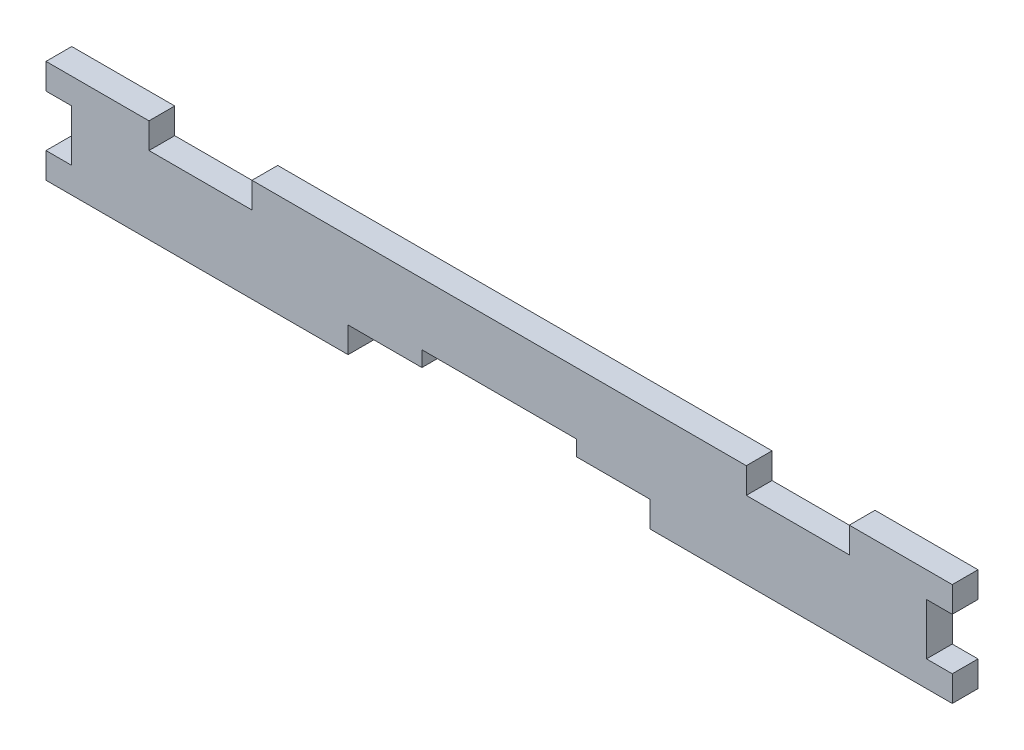
ISO-10303-21;
HEADER;
FILE_DESCRIPTION(('STEP AP214'),'2;1');
FILE_NAME('part.step','',(''),(''),'','','');
FILE_SCHEMA(('AUTOMOTIVE_DESIGN { 1 0 10303 214 1 1 1 1 }'));
ENDSEC;
DATA;
#1=APPLICATION_CONTEXT('core data for automotive mechanical design processes');
#2=APPLICATION_PROTOCOL_DEFINITION('international standard','automotive_design',2000,#1);
#3=PRODUCT_CONTEXT('',#1,'mechanical');
#4=PRODUCT('Part','Part','',(#3));
#5=PRODUCT_RELATED_PRODUCT_CATEGORY('part','',(#4));
#6=PRODUCT_DEFINITION_FORMATION('','',#4);
#7=PRODUCT_DEFINITION_CONTEXT('part definition',#1,'design');
#8=PRODUCT_DEFINITION('design','',#6,#7);
#9=PRODUCT_DEFINITION_SHAPE('','',#8);
#10=(LENGTH_UNIT() NAMED_UNIT(*) SI_UNIT(.MILLI.,.METRE.));
#11=(NAMED_UNIT(*) PLANE_ANGLE_UNIT() SI_UNIT($,.RADIAN.));
#12=(NAMED_UNIT(*) SI_UNIT($,.STERADIAN.) SOLID_ANGLE_UNIT());
#13=UNCERTAINTY_MEASURE_WITH_UNIT(LENGTH_MEASURE(1.E-05),#10,'distance_accuracy_value','');
#14=(GEOMETRIC_REPRESENTATION_CONTEXT(3) GLOBAL_UNCERTAINTY_ASSIGNED_CONTEXT((#13)) GLOBAL_UNIT_ASSIGNED_CONTEXT((#10,
#11,#12)) REPRESENTATION_CONTEXT('',''));
#15=CARTESIAN_POINT('',(0.,0.,0.));
#16=DIRECTION('',(0.,0.,1.));
#17=DIRECTION('',(1.,0.,0.));
#18=AXIS2_PLACEMENT_3D('',#15,#16,#17);
#19=CARTESIAN_POINT('',(58.6666666666667,5.,5.));
#20=DIRECTION('',(0.,1.,0.));
#21=DIRECTION('',(0.,0.,1.));
#22=AXIS2_PLACEMENT_3D('',#19,#20,#21);
#23=PLANE('',#22);
#24=DIRECTION('',(1.,0.,0.));
#25=VECTOR('',#24,1.);
#26=CARTESIAN_POINT('',(58.6666666666667,5.,0.));
#27=LINE('',#26,#25);
#28=CARTESIAN_POINT('',(58.6666666666667,5.,0.));
#29=VERTEX_POINT('',#28);
#30=CARTESIAN_POINT('',(73.0016666666667,5.,0.));
#31=VERTEX_POINT('',#30);
#32=EDGE_CURVE('E247',#29,#31,#27,.T.);
#33=ORIENTED_EDGE('',*,*,#32,.T.);
#34=DIRECTION('',(0.,0.,1.));
#35=VECTOR('',#34,1.);
#36=CARTESIAN_POINT('',(73.0016666666667,5.,-5.));
#37=LINE('',#36,#35);
#38=CARTESIAN_POINT('',(73.0016666666667,5.,5.));
#39=VERTEX_POINT('',#38);
#40=EDGE_CURVE('E378',#31,#39,#37,.T.);
#41=ORIENTED_EDGE('',*,*,#40,.T.);
#42=DIRECTION('',(1.,0.,0.));
#43=VECTOR('',#42,1.);
#44=CARTESIAN_POINT('',(58.6666666666667,5.,5.));
#45=LINE('',#44,#43);
#46=CARTESIAN_POINT('',(58.6666666666667,5.,5.));
#47=VERTEX_POINT('',#46);
#48=EDGE_CURVE('E390',#47,#39,#45,.T.);
#49=ORIENTED_EDGE('',*,*,#48,.F.);
#50=DIRECTION('',(0.,0.,-1.));
#51=VECTOR('',#50,1.);
#52=CARTESIAN_POINT('',(58.6666666666667,5.,5.));
#53=LINE('',#52,#51);
#54=EDGE_CURVE('E343',#47,#29,#53,.T.);
#55=ORIENTED_EDGE('',*,*,#54,.T.);
#56=EDGE_LOOP('',(#33,#41,#49,#55));
#57=FACE_BOUND('',#56,.T.);
#58=ADVANCED_FACE('F32',(#57),#23,.F.);
#59=CARTESIAN_POINT('',(0.,0.,5.));
#60=DIRECTION('',(1.,0.,0.));
#61=DIRECTION('',(0.,0.,-1.));
#62=AXIS2_PLACEMENT_3D('',#59,#60,#61);
#63=PLANE('',#62);
#64=DIRECTION('',(0.,-1.,0.));
#65=VECTOR('',#64,1.);
#66=CARTESIAN_POINT('',(0.,0.,0.));
#67=LINE('',#66,#65);
#68=CARTESIAN_POINT('',(0.,5.,0.));
#69=VERTEX_POINT('',#68);
#70=CARTESIAN_POINT('',(0.,0.,0.));
#71=VERTEX_POINT('',#70);
#72=EDGE_CURVE('E238',#69,#71,#67,.T.);
#73=ORIENTED_EDGE('',*,*,#72,.T.);
#74=DIRECTION('',(0.,0.,-1.));
#75=VECTOR('',#74,1.);
#76=CARTESIAN_POINT('',(0.,0.,5.));
#77=LINE('',#76,#75);
#78=CARTESIAN_POINT('',(0.,0.,5.));
#79=VERTEX_POINT('',#78);
#80=EDGE_CURVE('E349',#79,#71,#77,.T.);
#81=ORIENTED_EDGE('',*,*,#80,.F.);
#82=DIRECTION('',(0.,-1.,0.));
#83=VECTOR('',#82,1.);
#84=CARTESIAN_POINT('',(0.,0.,5.));
#85=LINE('',#84,#83);
#86=CARTESIAN_POINT('',(0.,5.,5.));
#87=VERTEX_POINT('',#86);
#88=EDGE_CURVE('E288',#87,#79,#85,.T.);
#89=ORIENTED_EDGE('',*,*,#88,.F.);
#90=DIRECTION('',(0.,0.,-1.));
#91=VECTOR('',#90,1.);
#92=CARTESIAN_POINT('',(0.,5.,5.));
#93=LINE('',#92,#91);
#94=EDGE_CURVE('E234',#87,#69,#93,.T.);
#95=ORIENTED_EDGE('',*,*,#94,.T.);
#96=EDGE_LOOP('',(#73,#81,#89,#95));
#97=FACE_BOUND('',#96,.T.);
#98=ADVANCED_FACE('F34',(#97),#63,.F.);
#99=CARTESIAN_POINT('',(0.,0.,5.));
#100=DIRECTION('',(0.,1.,0.));
#101=DIRECTION('',(0.,0.,1.));
#102=AXIS2_PLACEMENT_3D('',#99,#100,#101);
#103=PLANE('',#102);
#104=DIRECTION('',(1.,0.,0.));
#105=VECTOR('',#104,1.);
#106=CARTESIAN_POINT('',(0.,0.,0.));
#107=LINE('',#106,#105);
#108=CARTESIAN_POINT('',(58.6666666666667,0.,0.));
#109=VERTEX_POINT('',#108);
#110=EDGE_CURVE('E241',#71,#109,#107,.T.);
#111=ORIENTED_EDGE('',*,*,#110,.T.);
#112=DIRECTION('',(0.,0.,-1.));
#113=VECTOR('',#112,1.);
#114=CARTESIAN_POINT('',(58.6666666666667,0.,5.));
#115=LINE('',#114,#113);
#116=CARTESIAN_POINT('',(58.6666666666667,0.,5.));
#117=VERTEX_POINT('',#116);
#118=EDGE_CURVE('E346',#117,#109,#115,.T.);
#119=ORIENTED_EDGE('',*,*,#118,.F.);
#120=DIRECTION('',(1.,0.,0.));
#121=VECTOR('',#120,1.);
#122=CARTESIAN_POINT('',(0.,0.,5.));
#123=LINE('',#122,#121);
#124=EDGE_CURVE('E146',#79,#117,#123,.T.);
#125=ORIENTED_EDGE('',*,*,#124,.F.);
#126=ORIENTED_EDGE('',*,*,#80,.T.);
#127=EDGE_LOOP('',(#111,#119,#125,#126));
#128=FACE_BOUND('',#127,.T.);
#129=ADVANCED_FACE('F440',(#128),#103,.F.);
#130=CARTESIAN_POINT('',(58.6666666666667,0.,5.));
#131=DIRECTION('',(-1.,0.,0.));
#132=DIRECTION('',(0.,0.,1.));
#133=AXIS2_PLACEMENT_3D('',#130,#131,#132);
#134=PLANE('',#133);
#135=DIRECTION('',(0.,1.,0.));
#136=VECTOR('',#135,1.);
#137=CARTESIAN_POINT('',(58.6666666666667,0.,0.));
#138=LINE('',#137,#136);
#139=EDGE_CURVE('E244',#109,#29,#138,.T.);
#140=ORIENTED_EDGE('',*,*,#139,.T.);
#141=ORIENTED_EDGE('',*,*,#54,.F.);
#142=DIRECTION('',(0.,1.,0.));
#143=VECTOR('',#142,1.);
#144=CARTESIAN_POINT('',(58.6666666666667,0.,5.));
#145=LINE('',#144,#143);
#146=EDGE_CURVE('E388',#117,#47,#145,.T.);
#147=ORIENTED_EDGE('',*,*,#146,.F.);
#148=ORIENTED_EDGE('',*,*,#118,.T.);
#149=EDGE_LOOP('',(#140,#141,#147,#148));
#150=FACE_BOUND('',#149,.T.);
#151=ADVANCED_FACE('F443',(#150),#134,.F.);
#152=CARTESIAN_POINT('',(103.001666666667,5.,5.));
#153=VERTEX_POINT('',#152);
#154=CARTESIAN_POINT('',(117.333333333333,5.,5.));
#155=VERTEX_POINT('',#154);
#156=EDGE_CURVE('E377',#153,#155,#45,.T.);
#157=ORIENTED_EDGE('',*,*,#156,.F.);
#158=DIRECTION('',(0.,0.,1.));
#159=VECTOR('',#158,1.);
#160=CARTESIAN_POINT('',(103.001666666667,5.,-5.));
#161=LINE('',#160,#159);
#162=CARTESIAN_POINT('',(103.001666666667,5.,0.));
#163=VERTEX_POINT('',#162);
#164=EDGE_CURVE('E370',#163,#153,#161,.T.);
#165=ORIENTED_EDGE('',*,*,#164,.F.);
#166=CARTESIAN_POINT('',(117.333333333333,5.,0.));
#167=VERTEX_POINT('',#166);
#168=EDGE_CURVE('E246',#163,#167,#27,.T.);
#169=ORIENTED_EDGE('',*,*,#168,.T.);
#170=DIRECTION('',(0.,0.,-1.));
#171=VECTOR('',#170,1.);
#172=CARTESIAN_POINT('',(117.333333333333,5.,5.));
#173=LINE('',#172,#171);
#174=EDGE_CURVE('E340',#155,#167,#173,.T.);
#175=ORIENTED_EDGE('',*,*,#174,.F.);
#176=EDGE_LOOP('',(#157,#165,#169,#175));
#177=FACE_BOUND('',#176,.T.);
#178=ADVANCED_FACE('F375',(#177),#23,.F.);
#179=CARTESIAN_POINT('',(117.333333333333,0.,5.));
#180=DIRECTION('',(1.,0.,0.));
#181=DIRECTION('',(0.,0.,-1.));
#182=AXIS2_PLACEMENT_3D('',#179,#180,#181);
#183=PLANE('',#182);
#184=DIRECTION('',(0.,-1.,0.));
#185=VECTOR('',#184,1.);
#186=CARTESIAN_POINT('',(117.333333333333,0.,0.));
#187=LINE('',#186,#185);
#188=CARTESIAN_POINT('',(117.333333333333,0.,0.));
#189=VERTEX_POINT('',#188);
#190=EDGE_CURVE('E250',#167,#189,#187,.T.);
#191=ORIENTED_EDGE('',*,*,#190,.T.);
#192=DIRECTION('',(0.,0.,-1.));
#193=VECTOR('',#192,1.);
#194=CARTESIAN_POINT('',(117.333333333333,0.,5.));
#195=LINE('',#194,#193);
#196=CARTESIAN_POINT('',(117.333333333333,0.,5.));
#197=VERTEX_POINT('',#196);
#198=EDGE_CURVE('E337',#197,#189,#195,.T.);
#199=ORIENTED_EDGE('',*,*,#198,.F.);
#200=DIRECTION('',(0.,-1.,0.));
#201=VECTOR('',#200,1.);
#202=CARTESIAN_POINT('',(117.333333333333,0.,5.));
#203=LINE('',#202,#201);
#204=EDGE_CURVE('E392',#155,#197,#203,.T.);
#205=ORIENTED_EDGE('',*,*,#204,.F.);
#206=ORIENTED_EDGE('',*,*,#174,.T.);
#207=EDGE_LOOP('',(#191,#199,#205,#206));
#208=FACE_BOUND('',#207,.T.);
#209=ADVANCED_FACE('F468',(#208),#183,.F.);
#210=CARTESIAN_POINT('',(117.333333333333,0.,5.));
#211=DIRECTION('',(0.,1.,0.));
#212=DIRECTION('',(0.,0.,1.));
#213=AXIS2_PLACEMENT_3D('',#210,#211,#212);
#214=PLANE('',#213);
#215=DIRECTION('',(1.,0.,0.));
#216=VECTOR('',#215,1.);
#217=CARTESIAN_POINT('',(117.333333333333,0.,0.));
#218=LINE('',#217,#216);
#219=CARTESIAN_POINT('',(176.,0.,0.));
#220=VERTEX_POINT('',#219);
#221=EDGE_CURVE('E252',#189,#220,#218,.T.);
#222=ORIENTED_EDGE('',*,*,#221,.T.);
#223=DIRECTION('',(0.,0.,-1.));
#224=VECTOR('',#223,1.);
#225=CARTESIAN_POINT('',(176.,0.,5.));
#226=LINE('',#225,#224);
#227=CARTESIAN_POINT('',(176.,0.,5.));
#228=VERTEX_POINT('',#227);
#229=EDGE_CURVE('E334',#228,#220,#226,.T.);
#230=ORIENTED_EDGE('',*,*,#229,.F.);
#231=DIRECTION('',(1.,0.,0.));
#232=VECTOR('',#231,1.);
#233=CARTESIAN_POINT('',(117.333333333333,0.,5.));
#234=LINE('',#233,#232);
#235=EDGE_CURVE('E394',#197,#228,#234,.T.);
#236=ORIENTED_EDGE('',*,*,#235,.F.);
#237=ORIENTED_EDGE('',*,*,#198,.T.);
#238=EDGE_LOOP('',(#222,#230,#236,#237));
#239=FACE_BOUND('',#238,.T.);
#240=ADVANCED_FACE('F473',(#239),#214,.F.);
#241=CARTESIAN_POINT('',(176.,0.,5.));
#242=DIRECTION('',(-1.,0.,0.));
#243=DIRECTION('',(0.,0.,1.));
#244=AXIS2_PLACEMENT_3D('',#241,#242,#243);
#245=PLANE('',#244);
#246=DIRECTION('',(0.,1.,0.));
#247=VECTOR('',#246,1.);
#248=CARTESIAN_POINT('',(176.,0.,0.));
#249=LINE('',#248,#247);
#250=CARTESIAN_POINT('',(176.,5.,0.));
#251=VERTEX_POINT('',#250);
#252=EDGE_CURVE('E254',#220,#251,#249,.T.);
#253=ORIENTED_EDGE('',*,*,#252,.T.);
#254=DIRECTION('',(0.,0.,-1.));
#255=VECTOR('',#254,1.);
#256=CARTESIAN_POINT('',(176.,5.,5.));
#257=LINE('',#256,#255);
#258=CARTESIAN_POINT('',(176.,5.,5.));
#259=VERTEX_POINT('',#258);
#260=EDGE_CURVE('E331',#259,#251,#257,.T.);
#261=ORIENTED_EDGE('',*,*,#260,.F.);
#262=DIRECTION('',(0.,1.,0.));
#263=VECTOR('',#262,1.);
#264=CARTESIAN_POINT('',(176.,0.,5.));
#265=LINE('',#264,#263);
#266=EDGE_CURVE('E396',#228,#259,#265,.T.);
#267=ORIENTED_EDGE('',*,*,#266,.F.);
#268=ORIENTED_EDGE('',*,*,#229,.T.);
#269=EDGE_LOOP('',(#253,#261,#267,#268));
#270=FACE_BOUND('',#269,.T.);
#271=ADVANCED_FACE('F479',(#270),#245,.F.);
#272=CARTESIAN_POINT('',(176.,5.,5.));
#273=DIRECTION('',(0.,-1.,0.));
#274=DIRECTION('',(1.,0.,0.));
#275=AXIS2_PLACEMENT_3D('',#272,#273,#274);
#276=PLANE('',#275);
#277=DIRECTION('',(-1.,0.,0.));
#278=VECTOR('',#277,1.);
#279=CARTESIAN_POINT('',(176.,5.,0.));
#280=LINE('',#279,#278);
#281=CARTESIAN_POINT('',(171.,4.99999999999999,0.));
#282=VERTEX_POINT('',#281);
#283=EDGE_CURVE('E256',#251,#282,#280,.T.);
#284=ORIENTED_EDGE('',*,*,#283,.T.);
#285=DIRECTION('',(0.,0.,-1.));
#286=VECTOR('',#285,1.);
#287=CARTESIAN_POINT('',(171.,4.99999999999999,5.));
#288=LINE('',#287,#286);
#289=CARTESIAN_POINT('',(171.,4.99999999999999,5.));
#290=VERTEX_POINT('',#289);
#291=EDGE_CURVE('E328',#290,#282,#288,.T.);
#292=ORIENTED_EDGE('',*,*,#291,.F.);
#293=DIRECTION('',(-1.,0.,0.));
#294=VECTOR('',#293,1.);
#295=CARTESIAN_POINT('',(176.,5.,5.));
#296=LINE('',#295,#294);
#297=EDGE_CURVE('E398',#259,#290,#296,.T.);
#298=ORIENTED_EDGE('',*,*,#297,.F.);
#299=ORIENTED_EDGE('',*,*,#260,.T.);
#300=EDGE_LOOP('',(#284,#292,#298,#299));
#301=FACE_BOUND('',#300,.T.);
#302=ADVANCED_FACE('F483',(#301),#276,.F.);
#303=CARTESIAN_POINT('',(171.,15.,5.));
#304=DIRECTION('',(-1.,0.,0.));
#305=DIRECTION('',(0.,-1.,0.));
#306=AXIS2_PLACEMENT_3D('',#303,#304,#305);
#307=PLANE('',#306);
#308=DIRECTION('',(0.,1.,0.));
#309=VECTOR('',#308,1.);
#310=CARTESIAN_POINT('',(171.,15.,0.));
#311=LINE('',#310,#309);
#312=CARTESIAN_POINT('',(171.,15.,0.));
#313=VERTEX_POINT('',#312);
#314=EDGE_CURVE('E258',#282,#313,#311,.T.);
#315=ORIENTED_EDGE('',*,*,#314,.T.);
#316=DIRECTION('',(0.,0.,-1.));
#317=VECTOR('',#316,1.);
#318=CARTESIAN_POINT('',(171.,15.,5.));
#319=LINE('',#318,#317);
#320=CARTESIAN_POINT('',(171.,15.,5.));
#321=VERTEX_POINT('',#320);
#322=EDGE_CURVE('E325',#321,#313,#319,.T.);
#323=ORIENTED_EDGE('',*,*,#322,.F.);
#324=DIRECTION('',(0.,1.,0.));
#325=VECTOR('',#324,1.);
#326=CARTESIAN_POINT('',(171.,15.,5.));
#327=LINE('',#326,#325);
#328=EDGE_CURVE('E400',#290,#321,#327,.T.);
#329=ORIENTED_EDGE('',*,*,#328,.F.);
#330=ORIENTED_EDGE('',*,*,#291,.T.);
#331=EDGE_LOOP('',(#315,#323,#329,#330));
#332=FACE_BOUND('',#331,.T.);
#333=ADVANCED_FACE('F488',(#332),#307,.F.);
#334=CARTESIAN_POINT('',(176.,15.,5.));
#335=DIRECTION('',(0.,1.,0.));
#336=DIRECTION('',(0.,0.,1.));
#337=AXIS2_PLACEMENT_3D('',#334,#335,#336);
#338=PLANE('',#337);
#339=DIRECTION('',(1.,0.,0.));
#340=VECTOR('',#339,1.);
#341=CARTESIAN_POINT('',(176.,15.,0.));
#342=LINE('',#341,#340);
#343=CARTESIAN_POINT('',(176.,15.,0.));
#344=VERTEX_POINT('',#343);
#345=EDGE_CURVE('E260',#313,#344,#342,.T.);
#346=ORIENTED_EDGE('',*,*,#345,.T.);
#347=DIRECTION('',(0.,0.,-1.));
#348=VECTOR('',#347,1.);
#349=CARTESIAN_POINT('',(176.,15.,5.));
#350=LINE('',#349,#348);
#351=CARTESIAN_POINT('',(176.,15.,5.));
#352=VERTEX_POINT('',#351);
#353=EDGE_CURVE('E322',#352,#344,#350,.T.);
#354=ORIENTED_EDGE('',*,*,#353,.F.);
#355=DIRECTION('',(1.,0.,0.));
#356=VECTOR('',#355,1.);
#357=CARTESIAN_POINT('',(176.,15.,5.));
#358=LINE('',#357,#356);
#359=EDGE_CURVE('E402',#321,#352,#358,.T.);
#360=ORIENTED_EDGE('',*,*,#359,.F.);
#361=ORIENTED_EDGE('',*,*,#322,.T.);
#362=EDGE_LOOP('',(#346,#354,#360,#361));
#363=FACE_BOUND('',#362,.T.);
#364=ADVANCED_FACE('F494',(#363),#338,.F.);
#365=CARTESIAN_POINT('',(176.,15.,5.));
#366=DIRECTION('',(-1.,0.,0.));
#367=DIRECTION('',(0.,0.,1.));
#368=AXIS2_PLACEMENT_3D('',#365,#366,#367);
#369=PLANE('',#368);
#370=DIRECTION('',(0.,1.,0.));
#371=VECTOR('',#370,1.);
#372=CARTESIAN_POINT('',(176.,15.,0.));
#373=LINE('',#372,#371);
#374=CARTESIAN_POINT('',(176.,20.,0.));
#375=VERTEX_POINT('',#374);
#376=EDGE_CURVE('E262',#344,#375,#373,.T.);
#377=ORIENTED_EDGE('',*,*,#376,.T.);
#378=DIRECTION('',(0.,0.,-1.));
#379=VECTOR('',#378,1.);
#380=CARTESIAN_POINT('',(176.,20.,5.));
#381=LINE('',#380,#379);
#382=CARTESIAN_POINT('',(176.,20.,5.));
#383=VERTEX_POINT('',#382);
#384=EDGE_CURVE('E319',#383,#375,#381,.T.);
#385=ORIENTED_EDGE('',*,*,#384,.F.);
#386=DIRECTION('',(0.,1.,0.));
#387=VECTOR('',#386,1.);
#388=CARTESIAN_POINT('',(176.,15.,5.));
#389=LINE('',#388,#387);
#390=EDGE_CURVE('E404',#352,#383,#389,.T.);
#391=ORIENTED_EDGE('',*,*,#390,.F.);
#392=ORIENTED_EDGE('',*,*,#353,.T.);
#393=EDGE_LOOP('',(#377,#385,#391,#392));
#394=FACE_BOUND('',#393,.T.);
#395=ADVANCED_FACE('F498',(#394),#369,.F.);
#396=CARTESIAN_POINT('',(156.,20.,5.));
#397=DIRECTION('',(0.,-1.,0.));
#398=DIRECTION('',(0.,0.,-1.));
#399=AXIS2_PLACEMENT_3D('',#396,#397,#398);
#400=PLANE('',#399);
#401=DIRECTION('',(-1.,0.,0.));
#402=VECTOR('',#401,1.);
#403=CARTESIAN_POINT('',(156.,20.,0.));
#404=LINE('',#403,#402);
#405=CARTESIAN_POINT('',(156.,20.,0.));
#406=VERTEX_POINT('',#405);
#407=EDGE_CURVE('E264',#375,#406,#404,.T.);
#408=ORIENTED_EDGE('',*,*,#407,.T.);
#409=DIRECTION('',(0.,0.,-1.));
#410=VECTOR('',#409,1.);
#411=CARTESIAN_POINT('',(156.,20.,5.));
#412=LINE('',#411,#410);
#413=CARTESIAN_POINT('',(156.,20.,5.));
#414=VERTEX_POINT('',#413);
#415=EDGE_CURVE('E316',#414,#406,#412,.T.);
#416=ORIENTED_EDGE('',*,*,#415,.F.);
#417=DIRECTION('',(-1.,0.,0.));
#418=VECTOR('',#417,1.);
#419=CARTESIAN_POINT('',(156.,20.,5.));
#420=LINE('',#419,#418);
#421=EDGE_CURVE('E406',#383,#414,#420,.T.);
#422=ORIENTED_EDGE('',*,*,#421,.F.);
#423=ORIENTED_EDGE('',*,*,#384,.T.);
#424=EDGE_LOOP('',(#408,#416,#422,#423));
#425=FACE_BOUND('',#424,.T.);
#426=ADVANCED_FACE('F503',(#425),#400,.F.);
#427=CARTESIAN_POINT('',(156.,20.,5.));
#428=DIRECTION('',(1.,0.,0.));
#429=DIRECTION('',(0.,0.,-1.));
#430=AXIS2_PLACEMENT_3D('',#427,#428,#429);
#431=PLANE('',#430);
#432=DIRECTION('',(0.,-1.,0.));
#433=VECTOR('',#432,1.);
#434=CARTESIAN_POINT('',(156.,20.,0.));
#435=LINE('',#434,#433);
#436=CARTESIAN_POINT('',(156.,15.,0.));
#437=VERTEX_POINT('',#436);
#438=EDGE_CURVE('E266',#406,#437,#435,.T.);
#439=ORIENTED_EDGE('',*,*,#438,.T.);
#440=DIRECTION('',(0.,0.,-1.));
#441=VECTOR('',#440,1.);
#442=CARTESIAN_POINT('',(156.,15.,5.));
#443=LINE('',#442,#441);
#444=CARTESIAN_POINT('',(156.,15.,5.));
#445=VERTEX_POINT('',#444);
#446=EDGE_CURVE('E313',#445,#437,#443,.T.);
#447=ORIENTED_EDGE('',*,*,#446,.F.);
#448=DIRECTION('',(0.,-1.,0.));
#449=VECTOR('',#448,1.);
#450=CARTESIAN_POINT('',(156.,20.,5.));
#451=LINE('',#450,#449);
#452=EDGE_CURVE('E408',#414,#445,#451,.T.);
#453=ORIENTED_EDGE('',*,*,#452,.F.);
#454=ORIENTED_EDGE('',*,*,#415,.T.);
#455=EDGE_LOOP('',(#439,#447,#453,#454));
#456=FACE_BOUND('',#455,.T.);
#457=ADVANCED_FACE('F509',(#456),#431,.F.);
#458=CARTESIAN_POINT('',(156.,15.,5.));
#459=DIRECTION('',(0.,-1.,0.));
#460=DIRECTION('',(1.,0.,0.));
#461=AXIS2_PLACEMENT_3D('',#458,#459,#460);
#462=PLANE('',#461);
#463=DIRECTION('',(-1.,0.,0.));
#464=VECTOR('',#463,1.);
#465=CARTESIAN_POINT('',(156.,15.,0.));
#466=LINE('',#465,#464);
#467=CARTESIAN_POINT('',(136.,15.,0.));
#468=VERTEX_POINT('',#467);
#469=EDGE_CURVE('E268',#437,#468,#466,.T.);
#470=ORIENTED_EDGE('',*,*,#469,.T.);
#471=DIRECTION('',(0.,0.,-1.));
#472=VECTOR('',#471,1.);
#473=CARTESIAN_POINT('',(136.,15.,5.));
#474=LINE('',#473,#472);
#475=CARTESIAN_POINT('',(136.,15.,5.));
#476=VERTEX_POINT('',#475);
#477=EDGE_CURVE('E310',#476,#468,#474,.T.);
#478=ORIENTED_EDGE('',*,*,#477,.F.);
#479=DIRECTION('',(-1.,0.,0.));
#480=VECTOR('',#479,1.);
#481=CARTESIAN_POINT('',(156.,15.,5.));
#482=LINE('',#481,#480);
#483=EDGE_CURVE('E410',#445,#476,#482,.T.);
#484=ORIENTED_EDGE('',*,*,#483,.F.);
#485=ORIENTED_EDGE('',*,*,#446,.T.);
#486=EDGE_LOOP('',(#470,#478,#484,#485));
#487=FACE_BOUND('',#486,.T.);
#488=ADVANCED_FACE('F513',(#487),#462,.F.);
#489=CARTESIAN_POINT('',(136.,20.,5.));
#490=DIRECTION('',(-1.,0.,0.));
#491=DIRECTION('',(0.,-1.,0.));
#492=AXIS2_PLACEMENT_3D('',#489,#490,#491);
#493=PLANE('',#492);
#494=DIRECTION('',(0.,1.,0.));
#495=VECTOR('',#494,1.);
#496=CARTESIAN_POINT('',(136.,20.,0.));
#497=LINE('',#496,#495);
#498=CARTESIAN_POINT('',(136.,20.,0.));
#499=VERTEX_POINT('',#498);
#500=EDGE_CURVE('E270',#468,#499,#497,.T.);
#501=ORIENTED_EDGE('',*,*,#500,.T.);
#502=DIRECTION('',(0.,0.,-1.));
#503=VECTOR('',#502,1.);
#504=CARTESIAN_POINT('',(136.,20.,5.));
#505=LINE('',#504,#503);
#506=CARTESIAN_POINT('',(136.,20.,5.));
#507=VERTEX_POINT('',#506);
#508=EDGE_CURVE('E307',#507,#499,#505,.T.);
#509=ORIENTED_EDGE('',*,*,#508,.F.);
#510=DIRECTION('',(0.,1.,0.));
#511=VECTOR('',#510,1.);
#512=CARTESIAN_POINT('',(136.,20.,5.));
#513=LINE('',#512,#511);
#514=EDGE_CURVE('E412',#476,#507,#513,.T.);
#515=ORIENTED_EDGE('',*,*,#514,.F.);
#516=ORIENTED_EDGE('',*,*,#477,.T.);
#517=EDGE_LOOP('',(#501,#509,#515,#516));
#518=FACE_BOUND('',#517,.T.);
#519=ADVANCED_FACE('F518',(#518),#493,.F.);
#520=CARTESIAN_POINT('',(40.,20.,5.));
#521=DIRECTION('',(0.,-1.,0.));
#522=DIRECTION('',(1.,0.,0.));
#523=AXIS2_PLACEMENT_3D('',#520,#521,#522);
#524=PLANE('',#523);
#525=DIRECTION('',(-1.,0.,0.));
#526=VECTOR('',#525,1.);
#527=CARTESIAN_POINT('',(40.,20.,0.));
#528=LINE('',#527,#526);
#529=CARTESIAN_POINT('',(40.,20.,0.));
#530=VERTEX_POINT('',#529);
#531=EDGE_CURVE('E272',#499,#530,#528,.T.);
#532=ORIENTED_EDGE('',*,*,#531,.T.);
#533=DIRECTION('',(0.,0.,-1.));
#534=VECTOR('',#533,1.);
#535=CARTESIAN_POINT('',(40.,20.,5.));
#536=LINE('',#535,#534);
#537=CARTESIAN_POINT('',(40.,20.,5.));
#538=VERTEX_POINT('',#537);
#539=EDGE_CURVE('E304',#538,#530,#536,.T.);
#540=ORIENTED_EDGE('',*,*,#539,.F.);
#541=DIRECTION('',(-1.,0.,0.));
#542=VECTOR('',#541,1.);
#543=CARTESIAN_POINT('',(40.,20.,5.));
#544=LINE('',#543,#542);
#545=EDGE_CURVE('E414',#507,#538,#544,.T.);
#546=ORIENTED_EDGE('',*,*,#545,.F.);
#547=ORIENTED_EDGE('',*,*,#508,.T.);
#548=EDGE_LOOP('',(#532,#540,#546,#547));
#549=FACE_BOUND('',#548,.T.);
#550=ADVANCED_FACE('F524',(#549),#524,.F.);
#551=CARTESIAN_POINT('',(40.,20.,5.));
#552=DIRECTION('',(1.,0.,0.));
#553=DIRECTION('',(0.,1.,0.));
#554=AXIS2_PLACEMENT_3D('',#551,#552,#553);
#555=PLANE('',#554);
#556=DIRECTION('',(0.,-1.,0.));
#557=VECTOR('',#556,1.);
#558=CARTESIAN_POINT('',(40.,20.,0.));
#559=LINE('',#558,#557);
#560=CARTESIAN_POINT('',(40.,15.,0.));
#561=VERTEX_POINT('',#560);
#562=EDGE_CURVE('E274',#530,#561,#559,.T.);
#563=ORIENTED_EDGE('',*,*,#562,.T.);
#564=DIRECTION('',(0.,0.,-1.));
#565=VECTOR('',#564,1.);
#566=CARTESIAN_POINT('',(40.,15.,5.));
#567=LINE('',#566,#565);
#568=CARTESIAN_POINT('',(40.,15.,5.));
#569=VERTEX_POINT('',#568);
#570=EDGE_CURVE('E301',#569,#561,#567,.T.);
#571=ORIENTED_EDGE('',*,*,#570,.F.);
#572=DIRECTION('',(0.,-1.,0.));
#573=VECTOR('',#572,1.);
#574=CARTESIAN_POINT('',(40.,20.,5.));
#575=LINE('',#574,#573);
#576=EDGE_CURVE('E416',#538,#569,#575,.T.);
#577=ORIENTED_EDGE('',*,*,#576,.F.);
#578=ORIENTED_EDGE('',*,*,#539,.T.);
#579=EDGE_LOOP('',(#563,#571,#577,#578));
#580=FACE_BOUND('',#579,.T.);
#581=ADVANCED_FACE('F528',(#580),#555,.F.);
#582=CARTESIAN_POINT('',(20.,15.,5.));
#583=DIRECTION('',(0.,-1.,0.));
#584=DIRECTION('',(0.,0.,-1.));
#585=AXIS2_PLACEMENT_3D('',#582,#583,#584);
#586=PLANE('',#585);
#587=DIRECTION('',(-1.,0.,0.));
#588=VECTOR('',#587,1.);
#589=CARTESIAN_POINT('',(20.,15.,0.));
#590=LINE('',#589,#588);
#591=CARTESIAN_POINT('',(20.,15.,0.));
#592=VERTEX_POINT('',#591);
#593=EDGE_CURVE('E276',#561,#592,#590,.T.);
#594=ORIENTED_EDGE('',*,*,#593,.T.);
#595=DIRECTION('',(0.,0.,-1.));
#596=VECTOR('',#595,1.);
#597=CARTESIAN_POINT('',(20.,15.,5.));
#598=LINE('',#597,#596);
#599=CARTESIAN_POINT('',(20.,15.,5.));
#600=VERTEX_POINT('',#599);
#601=EDGE_CURVE('E298',#600,#592,#598,.T.);
#602=ORIENTED_EDGE('',*,*,#601,.F.);
#603=DIRECTION('',(-1.,0.,0.));
#604=VECTOR('',#603,1.);
#605=CARTESIAN_POINT('',(20.,15.,5.));
#606=LINE('',#605,#604);
#607=EDGE_CURVE('E418',#569,#600,#606,.T.);
#608=ORIENTED_EDGE('',*,*,#607,.F.);
#609=ORIENTED_EDGE('',*,*,#570,.T.);
#610=EDGE_LOOP('',(#594,#602,#608,#609));
#611=FACE_BOUND('',#610,.T.);
#612=ADVANCED_FACE('F533',(#611),#586,.F.);
#613=CARTESIAN_POINT('',(20.,20.,5.));
#614=DIRECTION('',(-1.,0.,0.));
#615=DIRECTION('',(0.,0.,1.));
#616=AXIS2_PLACEMENT_3D('',#613,#614,#615);
#617=PLANE('',#616);
#618=DIRECTION('',(0.,1.,0.));
#619=VECTOR('',#618,1.);
#620=CARTESIAN_POINT('',(20.,20.,0.));
#621=LINE('',#620,#619);
#622=CARTESIAN_POINT('',(20.,20.,0.));
#623=VERTEX_POINT('',#622);
#624=EDGE_CURVE('E278',#592,#623,#621,.T.);
#625=ORIENTED_EDGE('',*,*,#624,.T.);
#626=DIRECTION('',(0.,0.,-1.));
#627=VECTOR('',#626,1.);
#628=CARTESIAN_POINT('',(20.,20.,5.));
#629=LINE('',#628,#627);
#630=CARTESIAN_POINT('',(20.,20.,5.));
#631=VERTEX_POINT('',#630);
#632=EDGE_CURVE('E295',#631,#623,#629,.T.);
#633=ORIENTED_EDGE('',*,*,#632,.F.);
#634=DIRECTION('',(0.,1.,0.));
#635=VECTOR('',#634,1.);
#636=CARTESIAN_POINT('',(20.,20.,5.));
#637=LINE('',#636,#635);
#638=EDGE_CURVE('E420',#600,#631,#637,.T.);
#639=ORIENTED_EDGE('',*,*,#638,.F.);
#640=ORIENTED_EDGE('',*,*,#601,.T.);
#641=EDGE_LOOP('',(#625,#633,#639,#640));
#642=FACE_BOUND('',#641,.T.);
#643=ADVANCED_FACE('F536',(#642),#617,.F.);
#644=CARTESIAN_POINT('',(0.,20.,5.));
#645=DIRECTION('',(0.,-1.,0.));
#646=DIRECTION('',(0.,0.,-1.));
#647=AXIS2_PLACEMENT_3D('',#644,#645,#646);
#648=PLANE('',#647);
#649=DIRECTION('',(-1.,0.,0.));
#650=VECTOR('',#649,1.);
#651=CARTESIAN_POINT('',(0.,20.,0.));
#652=LINE('',#651,#650);
#653=CARTESIAN_POINT('',(0.,20.,0.));
#654=VERTEX_POINT('',#653);
#655=EDGE_CURVE('E280',#623,#654,#652,.T.);
#656=ORIENTED_EDGE('',*,*,#655,.T.);
#657=DIRECTION('',(0.,0.,-1.));
#658=VECTOR('',#657,1.);
#659=CARTESIAN_POINT('',(0.,20.,5.));
#660=LINE('',#659,#658);
#661=CARTESIAN_POINT('',(0.,20.,5.));
#662=VERTEX_POINT('',#661);
#663=EDGE_CURVE('E292',#662,#654,#660,.T.);
#664=ORIENTED_EDGE('',*,*,#663,.F.);
#665=DIRECTION('',(-1.,0.,0.));
#666=VECTOR('',#665,1.);
#667=CARTESIAN_POINT('',(0.,20.,5.));
#668=LINE('',#667,#666);
#669=EDGE_CURVE('E422',#631,#662,#668,.T.);
#670=ORIENTED_EDGE('',*,*,#669,.F.);
#671=ORIENTED_EDGE('',*,*,#632,.T.);
#672=EDGE_LOOP('',(#656,#664,#670,#671));
#673=FACE_BOUND('',#672,.T.);
#674=ADVANCED_FACE('F428',(#673),#648,.F.);
#675=CARTESIAN_POINT('',(0.,15.,5.));
#676=DIRECTION('',(1.,0.,0.));
#677=DIRECTION('',(0.,1.,0.));
#678=AXIS2_PLACEMENT_3D('',#675,#676,#677);
#679=PLANE('',#678);
#680=DIRECTION('',(0.,-1.,0.));
#681=VECTOR('',#680,1.);
#682=CARTESIAN_POINT('',(0.,15.,0.));
#683=LINE('',#682,#681);
#684=CARTESIAN_POINT('',(0.,15.,0.));
#685=VERTEX_POINT('',#684);
#686=EDGE_CURVE('E282',#654,#685,#683,.T.);
#687=ORIENTED_EDGE('',*,*,#686,.T.);
#688=DIRECTION('',(0.,0.,-1.));
#689=VECTOR('',#688,1.);
#690=CARTESIAN_POINT('',(0.,15.,5.));
#691=LINE('',#690,#689);
#692=CARTESIAN_POINT('',(0.,15.,5.));
#693=VERTEX_POINT('',#692);
#694=EDGE_CURVE('E229',#693,#685,#691,.T.);
#695=ORIENTED_EDGE('',*,*,#694,.F.);
#696=DIRECTION('',(0.,-1.,0.));
#697=VECTOR('',#696,1.);
#698=CARTESIAN_POINT('',(0.,15.,5.));
#699=LINE('',#698,#697);
#700=EDGE_CURVE('E217',#662,#693,#699,.T.);
#701=ORIENTED_EDGE('',*,*,#700,.F.);
#702=ORIENTED_EDGE('',*,*,#663,.T.);
#703=EDGE_LOOP('',(#687,#695,#701,#702));
#704=FACE_BOUND('',#703,.T.);
#705=ADVANCED_FACE('F432',(#704),#679,.F.);
#706=CARTESIAN_POINT('',(0.,15.,5.));
#707=DIRECTION('',(0.,1.,0.));
#708=DIRECTION('',(0.,0.,1.));
#709=AXIS2_PLACEMENT_3D('',#706,#707,#708);
#710=PLANE('',#709);
#711=DIRECTION('',(1.,0.,0.));
#712=VECTOR('',#711,1.);
#713=CARTESIAN_POINT('',(0.,15.,0.));
#714=LINE('',#713,#712);
#715=CARTESIAN_POINT('',(5.,15.,0.));
#716=VERTEX_POINT('',#715);
#717=EDGE_CURVE('E226',#685,#716,#714,.T.);
#718=ORIENTED_EDGE('',*,*,#717,.T.);
#719=DIRECTION('',(0.,0.,-1.));
#720=VECTOR('',#719,1.);
#721=CARTESIAN_POINT('',(5.,15.,5.));
#722=LINE('',#721,#720);
#723=CARTESIAN_POINT('',(5.,15.,5.));
#724=VERTEX_POINT('',#723);
#725=EDGE_CURVE('E223',#724,#716,#722,.T.);
#726=ORIENTED_EDGE('',*,*,#725,.F.);
#727=DIRECTION('',(1.,0.,0.));
#728=VECTOR('',#727,1.);
#729=CARTESIAN_POINT('',(0.,15.,5.));
#730=LINE('',#729,#728);
#731=EDGE_CURVE('E209',#693,#724,#730,.T.);
#732=ORIENTED_EDGE('',*,*,#731,.F.);
#733=ORIENTED_EDGE('',*,*,#694,.T.);
#734=EDGE_LOOP('',(#718,#726,#732,#733));
#735=FACE_BOUND('',#734,.T.);
#736=ADVANCED_FACE('F224',(#735),#710,.F.);
#737=CARTESIAN_POINT('',(5.,15.,5.));
#738=DIRECTION('',(1.,0.,0.));
#739=DIRECTION('',(0.,1.,0.));
#740=AXIS2_PLACEMENT_3D('',#737,#738,#739);
#741=PLANE('',#740);
#742=DIRECTION('',(0.,-1.,0.));
#743=VECTOR('',#742,1.);
#744=CARTESIAN_POINT('',(5.,15.,0.));
#745=LINE('',#744,#743);
#746=CARTESIAN_POINT('',(5.,4.99999999999999,0.));
#747=VERTEX_POINT('',#746);
#748=EDGE_CURVE('E285',#716,#747,#745,.T.);
#749=ORIENTED_EDGE('',*,*,#748,.T.);
#750=DIRECTION('',(0.,0.,-1.));
#751=VECTOR('',#750,1.);
#752=CARTESIAN_POINT('',(5.,4.99999999999999,5.));
#753=LINE('',#752,#751);
#754=CARTESIAN_POINT('',(5.,4.99999999999999,5.));
#755=VERTEX_POINT('',#754);
#756=EDGE_CURVE('E230',#755,#747,#753,.T.);
#757=ORIENTED_EDGE('',*,*,#756,.F.);
#758=DIRECTION('',(0.,-1.,0.));
#759=VECTOR('',#758,1.);
#760=CARTESIAN_POINT('',(5.,15.,5.));
#761=LINE('',#760,#759);
#762=EDGE_CURVE('E214',#724,#755,#761,.T.);
#763=ORIENTED_EDGE('',*,*,#762,.F.);
#764=ORIENTED_EDGE('',*,*,#725,.T.);
#765=EDGE_LOOP('',(#749,#757,#763,#764));
#766=FACE_BOUND('',#765,.T.);
#767=ADVANCED_FACE('F232',(#766),#741,.F.);
#768=CARTESIAN_POINT('',(0.,5.,5.));
#769=DIRECTION('',(0.,-1.,0.));
#770=DIRECTION('',(1.,0.,0.));
#771=AXIS2_PLACEMENT_3D('',#768,#769,#770);
#772=PLANE('',#771);
#773=DIRECTION('',(-1.,0.,0.));
#774=VECTOR('',#773,1.);
#775=CARTESIAN_POINT('',(0.,5.,0.));
#776=LINE('',#775,#774);
#777=EDGE_CURVE('E137',#747,#69,#776,.T.);
#778=ORIENTED_EDGE('',*,*,#777,.T.);
#779=ORIENTED_EDGE('',*,*,#94,.F.);
#780=DIRECTION('',(-1.,0.,0.));
#781=VECTOR('',#780,1.);
#782=CARTESIAN_POINT('',(0.,5.,5.));
#783=LINE('',#782,#781);
#784=EDGE_CURVE('E56',#755,#87,#783,.T.);
#785=ORIENTED_EDGE('',*,*,#784,.F.);
#786=ORIENTED_EDGE('',*,*,#756,.T.);
#787=EDGE_LOOP('',(#778,#779,#785,#786));
#788=FACE_BOUND('',#787,.T.);
#789=ADVANCED_FACE('F434',(#788),#772,.F.);
#790=CARTESIAN_POINT('',(0.,0.,5.));
#791=DIRECTION('',(0.,0.,-1.));
#792=DIRECTION('',(-1.,0.,0.));
#793=AXIS2_PLACEMENT_3D('',#790,#791,#792);
#794=PLANE('',#793);
#795=ORIENTED_EDGE('',*,*,#48,.T.);
#796=DIRECTION('',(0.,-1.,0.));
#797=VECTOR('',#796,1.);
#798=CARTESIAN_POINT('',(73.0016666666667,5.,5.));
#799=LINE('',#798,#797);
#800=CARTESIAN_POINT('',(73.0016666666667,8.,5.));
#801=VERTEX_POINT('',#800);
#802=EDGE_CURVE('E453',#801,#39,#799,.T.);
#803=ORIENTED_EDGE('',*,*,#802,.F.);
#804=DIRECTION('',(-1.,0.,0.));
#805=VECTOR('',#804,1.);
#806=CARTESIAN_POINT('',(73.0016666666667,8.,5.));
#807=LINE('',#806,#805);
#808=CARTESIAN_POINT('',(103.001666666667,8.,5.));
#809=VERTEX_POINT('',#808);
#810=EDGE_CURVE('E382',#809,#801,#807,.T.);
#811=ORIENTED_EDGE('',*,*,#810,.F.);
#812=DIRECTION('',(0.,1.,0.));
#813=VECTOR('',#812,1.);
#814=CARTESIAN_POINT('',(103.001666666667,5.,5.));
#815=LINE('',#814,#813);
#816=EDGE_CURVE('E461',#153,#809,#815,.T.);
#817=ORIENTED_EDGE('',*,*,#816,.F.);
#818=ORIENTED_EDGE('',*,*,#156,.T.);
#819=ORIENTED_EDGE('',*,*,#204,.T.);
#820=ORIENTED_EDGE('',*,*,#235,.T.);
#821=ORIENTED_EDGE('',*,*,#266,.T.);
#822=ORIENTED_EDGE('',*,*,#297,.T.);
#823=ORIENTED_EDGE('',*,*,#328,.T.);
#824=ORIENTED_EDGE('',*,*,#359,.T.);
#825=ORIENTED_EDGE('',*,*,#390,.T.);
#826=ORIENTED_EDGE('',*,*,#421,.T.);
#827=ORIENTED_EDGE('',*,*,#452,.T.);
#828=ORIENTED_EDGE('',*,*,#483,.T.);
#829=ORIENTED_EDGE('',*,*,#514,.T.);
#830=ORIENTED_EDGE('',*,*,#545,.T.);
#831=ORIENTED_EDGE('',*,*,#576,.T.);
#832=ORIENTED_EDGE('',*,*,#607,.T.);
#833=ORIENTED_EDGE('',*,*,#638,.T.);
#834=ORIENTED_EDGE('',*,*,#669,.T.);
#835=ORIENTED_EDGE('',*,*,#700,.T.);
#836=ORIENTED_EDGE('',*,*,#731,.T.);
#837=ORIENTED_EDGE('',*,*,#762,.T.);
#838=ORIENTED_EDGE('',*,*,#784,.T.);
#839=ORIENTED_EDGE('',*,*,#88,.T.);
#840=ORIENTED_EDGE('',*,*,#124,.T.);
#841=ORIENTED_EDGE('',*,*,#146,.T.);
#842=EDGE_LOOP('',(#795,#803,#811,#817,#818,#819,#820,#821,#822,#823,#824,#825,#826,#827,#828,
#829,#830,#831,#832,#833,#834,#835,#836,#837,#838,#839,#840,#841));
#843=FACE_BOUND('',#842,.T.);
#844=ADVANCED_FACE('F212',(#843),#794,.F.);
#845=CARTESIAN_POINT('',(0.,0.,0.));
#846=DIRECTION('',(0.,0.,-1.));
#847=DIRECTION('',(-1.,0.,0.));
#848=AXIS2_PLACEMENT_3D('',#845,#846,#847);
#849=PLANE('',#848);
#850=DIRECTION('',(0.,1.,0.));
#851=VECTOR('',#850,1.);
#852=CARTESIAN_POINT('',(73.0016666666667,0.,0.));
#853=LINE('',#852,#851);
#854=CARTESIAN_POINT('',(73.0016666666667,8.,0.));
#855=VERTEX_POINT('',#854);
#856=EDGE_CURVE('E11',#31,#855,#853,.T.);
#857=ORIENTED_EDGE('',*,*,#856,.F.);
#858=ORIENTED_EDGE('',*,*,#32,.F.);
#859=ORIENTED_EDGE('',*,*,#139,.F.);
#860=ORIENTED_EDGE('',*,*,#110,.F.);
#861=ORIENTED_EDGE('',*,*,#72,.F.);
#862=ORIENTED_EDGE('',*,*,#777,.F.);
#863=ORIENTED_EDGE('',*,*,#748,.F.);
#864=ORIENTED_EDGE('',*,*,#717,.F.);
#865=ORIENTED_EDGE('',*,*,#686,.F.);
#866=ORIENTED_EDGE('',*,*,#655,.F.);
#867=ORIENTED_EDGE('',*,*,#624,.F.);
#868=ORIENTED_EDGE('',*,*,#593,.F.);
#869=ORIENTED_EDGE('',*,*,#562,.F.);
#870=ORIENTED_EDGE('',*,*,#531,.F.);
#871=ORIENTED_EDGE('',*,*,#500,.F.);
#872=ORIENTED_EDGE('',*,*,#469,.F.);
#873=ORIENTED_EDGE('',*,*,#438,.F.);
#874=ORIENTED_EDGE('',*,*,#407,.F.);
#875=ORIENTED_EDGE('',*,*,#376,.F.);
#876=ORIENTED_EDGE('',*,*,#345,.F.);
#877=ORIENTED_EDGE('',*,*,#314,.F.);
#878=ORIENTED_EDGE('',*,*,#283,.F.);
#879=ORIENTED_EDGE('',*,*,#252,.F.);
#880=ORIENTED_EDGE('',*,*,#221,.F.);
#881=ORIENTED_EDGE('',*,*,#190,.F.);
#882=ORIENTED_EDGE('',*,*,#168,.F.);
#883=DIRECTION('',(0.,-1.,0.));
#884=VECTOR('',#883,1.);
#885=CARTESIAN_POINT('',(103.001666666667,0.,0.));
#886=LINE('',#885,#884);
#887=CARTESIAN_POINT('',(103.001666666667,8.,0.));
#888=VERTEX_POINT('',#887);
#889=EDGE_CURVE('E351',#888,#163,#886,.T.);
#890=ORIENTED_EDGE('',*,*,#889,.F.);
#891=DIRECTION('',(1.,0.,0.));
#892=VECTOR('',#891,1.);
#893=CARTESIAN_POINT('',(0.,8.,0.));
#894=LINE('',#893,#892);
#895=EDGE_CURVE('E40',#855,#888,#894,.T.);
#896=ORIENTED_EDGE('',*,*,#895,.F.);
#897=EDGE_LOOP('',(#857,#858,#859,#860,#861,#862,#863,#864,#865,#866,#867,#868,#869,#870,#871,
#872,#873,#874,#875,#876,#877,#878,#879,#880,#881,#882,#890,#896));
#898=FACE_BOUND('',#897,.T.);
#899=ADVANCED_FACE('F363',(#898),#849,.T.);
#900=CARTESIAN_POINT('',(73.0016666666667,5.,-5.));
#901=DIRECTION('',(-1.,0.,0.));
#902=DIRECTION('',(0.,0.,1.));
#903=AXIS2_PLACEMENT_3D('',#900,#901,#902);
#904=PLANE('',#903);
#905=ORIENTED_EDGE('',*,*,#856,.T.);
#906=DIRECTION('',(0.,0.,1.));
#907=VECTOR('',#906,1.);
#908=CARTESIAN_POINT('',(73.0016666666667,8.,-5.));
#909=LINE('',#908,#907);
#910=EDGE_CURVE('E242',#855,#801,#909,.T.);
#911=ORIENTED_EDGE('',*,*,#910,.T.);
#912=ORIENTED_EDGE('',*,*,#802,.T.);
#913=ORIENTED_EDGE('',*,*,#40,.F.);
#914=EDGE_LOOP('',(#905,#911,#912,#913));
#915=FACE_BOUND('',#914,.T.);
#916=ADVANCED_FACE('F460',(#915),#904,.F.);
#917=CARTESIAN_POINT('',(73.0016666666667,8.,-5.));
#918=DIRECTION('',(0.,1.,0.));
#919=DIRECTION('',(0.,0.,1.));
#920=AXIS2_PLACEMENT_3D('',#917,#918,#919);
#921=PLANE('',#920);
#922=ORIENTED_EDGE('',*,*,#895,.T.);
#923=DIRECTION('',(0.,0.,1.));
#924=VECTOR('',#923,1.);
#925=CARTESIAN_POINT('',(103.001666666667,8.,-5.));
#926=LINE('',#925,#924);
#927=EDGE_CURVE('E47',#888,#809,#926,.T.);
#928=ORIENTED_EDGE('',*,*,#927,.T.);
#929=ORIENTED_EDGE('',*,*,#810,.T.);
#930=ORIENTED_EDGE('',*,*,#910,.F.);
#931=EDGE_LOOP('',(#922,#928,#929,#930));
#932=FACE_BOUND('',#931,.T.);
#933=ADVANCED_FACE('F356',(#932),#921,.F.);
#934=CARTESIAN_POINT('',(103.001666666667,5.,-5.));
#935=DIRECTION('',(1.,0.,0.));
#936=DIRECTION('',(0.,0.,-1.));
#937=AXIS2_PLACEMENT_3D('',#934,#935,#936);
#938=PLANE('',#937);
#939=ORIENTED_EDGE('',*,*,#889,.T.);
#940=ORIENTED_EDGE('',*,*,#164,.T.);
#941=ORIENTED_EDGE('',*,*,#816,.T.);
#942=ORIENTED_EDGE('',*,*,#927,.F.);
#943=EDGE_LOOP('',(#939,#940,#941,#942));
#944=FACE_BOUND('',#943,.T.);
#945=ADVANCED_FACE('F368',(#944),#938,.F.);
#946=CLOSED_SHELL('',(#58,#98,#129,#151,#178,#209,#240,#271,#302,#333,#364,#395,#426,#457,#488,
#519,#550,#581,#612,#643,#674,#705,#736,#767,#789,#844,#899,#916,#933,#945));
#947=MANIFOLD_SOLID_BREP('B2',#946);
#948=ADVANCED_BREP_SHAPE_REPRESENTATION('',(#18,#947),#14);
#949=SHAPE_DEFINITION_REPRESENTATION(#9,#948);
ENDSEC;
END-ISO-10303-21;
